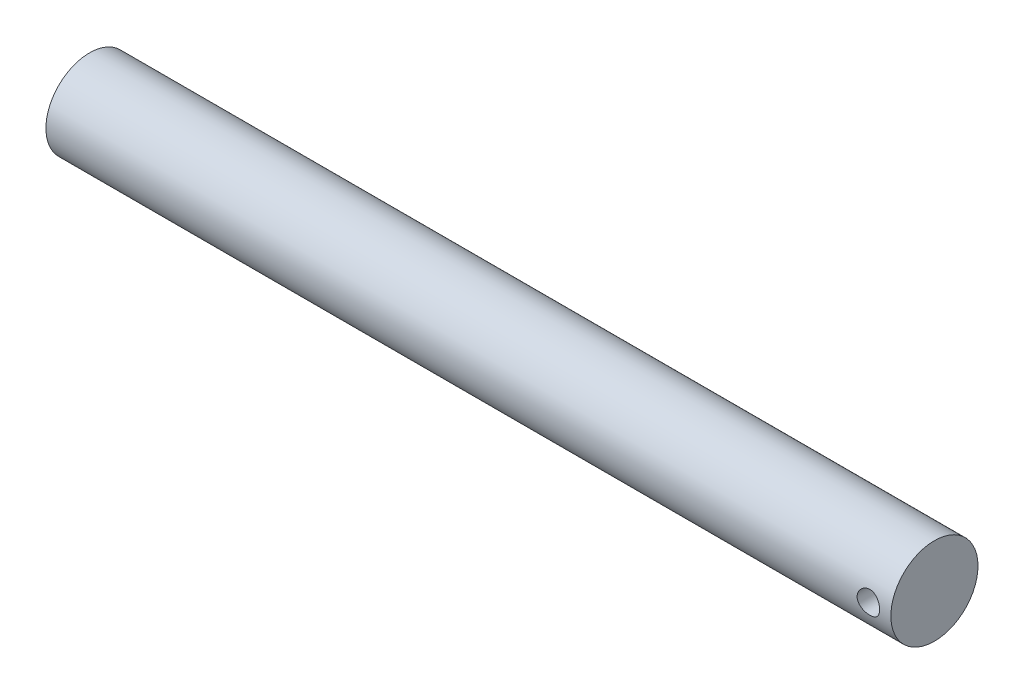
ISO-10303-21;
HEADER;
FILE_DESCRIPTION(('STEP AP214'),'2;1');
FILE_NAME('part.step','',(''),(''),'','','');
FILE_SCHEMA(('AUTOMOTIVE_DESIGN { 1 0 10303 214 1 1 1 1 }'));
ENDSEC;
DATA;
#1=APPLICATION_CONTEXT('core data for automotive mechanical design processes');
#2=APPLICATION_PROTOCOL_DEFINITION('international standard','automotive_design',2000,#1);
#3=PRODUCT_CONTEXT('',#1,'mechanical');
#4=PRODUCT('Part','Part','',(#3));
#5=PRODUCT_RELATED_PRODUCT_CATEGORY('part','',(#4));
#6=PRODUCT_DEFINITION_FORMATION('','',#4);
#7=PRODUCT_DEFINITION_CONTEXT('part definition',#1,'design');
#8=PRODUCT_DEFINITION('design','',#6,#7);
#9=PRODUCT_DEFINITION_SHAPE('','',#8);
#10=(LENGTH_UNIT() NAMED_UNIT(*) SI_UNIT(.MILLI.,.METRE.));
#11=(NAMED_UNIT(*) PLANE_ANGLE_UNIT() SI_UNIT($,.RADIAN.));
#12=(NAMED_UNIT(*) SI_UNIT($,.STERADIAN.) SOLID_ANGLE_UNIT());
#13=UNCERTAINTY_MEASURE_WITH_UNIT(LENGTH_MEASURE(1.E-05),#10,'distance_accuracy_value','');
#14=(GEOMETRIC_REPRESENTATION_CONTEXT(3) GLOBAL_UNCERTAINTY_ASSIGNED_CONTEXT((#13)) GLOBAL_UNIT_ASSIGNED_CONTEXT((#10,
#11,#12)) REPRESENTATION_CONTEXT('',''));
#15=CARTESIAN_POINT('',(0.,0.,0.));
#16=DIRECTION('',(0.,0.,1.));
#17=DIRECTION('',(1.,0.,0.));
#18=AXIS2_PLACEMENT_3D('',#15,#16,#17);
#19=CARTESIAN_POINT('',(127.214403743369,-1.4519796858127E-07,1.62563176598982E-07));
#20=DIRECTION('',(-1.,0.,0.));
#21=DIRECTION('',(0.,0.,1.));
#22=AXIS2_PLACEMENT_3D('',#19,#20,#21);
#23=CYLINDRICAL_SURFACE('',#22,7.275);
#24=CARTESIAN_POINT('',(125.339403743369,-1.4519796858127E-07,-7.27499983743682));
#25=CARTESIAN_POINT('',(125.339401035922,0.10348926710912,-7.27499816530983));
#26=CARTESIAN_POINT('',(125.330806916012,0.207008341885682,-7.27276969935665));
#27=CARTESIAN_POINT('',(125.296713254932,0.41107266522187,-7.26409605904251));
#28=CARTESIAN_POINT('',(125.271204793774,0.511616315412951,-7.25764865979818));
#29=CARTESIAN_POINT('',(125.204160601778,0.706754033756443,-7.24125004171158));
#30=CARTESIAN_POINT('',(125.162644768357,0.801355319260996,-7.23130317410223));
#31=CARTESIAN_POINT('',(125.06483604422,0.982251491087056,-7.20896123905966));
#32=CARTESIAN_POINT('',(125.008542430419,1.06854597067008,-7.19656605183633));
#33=CARTESIAN_POINT('',(124.881481134157,1.23225867447176,-7.17036786662899));
#34=CARTESIAN_POINT('',(124.810451784011,1.30947017108247,-7.15654206723138));
#35=CARTESIAN_POINT('',(124.656495109594,1.45102738342895,-7.12919005835779));
#36=CARTESIAN_POINT('',(124.573566360131,1.51537155583026,-7.11566388499239));
#37=CARTESIAN_POINT('',(124.39653926766,1.63035614136393,-7.09021121733508));
#38=CARTESIAN_POINT('',(124.302284243378,1.68076230565845,-7.07831358937699));
#39=CARTESIAN_POINT('',(124.106281704587,1.76493252948175,-7.05779888625709));
#40=CARTESIAN_POINT('',(124.004535474543,1.79869943442898,-7.04918125025335));
#41=CARTESIAN_POINT('',(123.798719442665,1.847921568059,-7.03643708937709));
#42=CARTESIAN_POINT('',(123.694744669504,1.86374993011354,-7.03221920112057));
#43=CARTESIAN_POINT('',(123.48553653968,1.87780840769314,-7.02847885719754));
#44=CARTESIAN_POINT('',(123.38030340471,1.87604157872928,-7.02895558628227));
#45=CARTESIAN_POINT('',(123.17444934159,1.85525685938531,-7.03446864603381));
#46=CARTESIAN_POINT('',(123.073779536908,1.8366867120066,-7.03938662790732));
#47=CARTESIAN_POINT('',(122.877034821839,1.78353805164649,-7.05303904744507));
#48=CARTESIAN_POINT('',(122.780960257651,1.74895833461543,-7.0617737721566));
#49=CARTESIAN_POINT('',(122.59494794822,1.66439823168143,-7.08218203124035));
#50=CARTESIAN_POINT('',(122.50508638438,1.61425788113159,-7.09388584874994));
#51=CARTESIAN_POINT('',(122.334893391913,1.50011155565221,-7.1188968471342));
#52=CARTESIAN_POINT('',(122.254563730957,1.43610301509652,-7.13220432448479));
#53=CARTESIAN_POINT('',(122.103152435688,1.29373166470888,-7.15941894729276));
#54=CARTESIAN_POINT('',(122.032425895394,1.21499184912191,-7.17333202861794));
#55=CARTESIAN_POINT('',(121.90511137327,1.04660076869289,-7.19982657248157));
#56=CARTESIAN_POINT('',(121.848523878416,0.956949128184511,-7.21240798914629));
#57=CARTESIAN_POINT('',(121.75095160377,0.768752915111847,-7.23489079305921));
#58=CARTESIAN_POINT('',(121.710027501854,0.670175551962985,-7.24478171576072));
#59=CARTESIAN_POINT('',(121.645432428361,0.467227886541009,-7.26069322763163));
#60=CARTESIAN_POINT('',(121.621757942753,0.362858768808884,-7.26671460506188));
#61=CARTESIAN_POINT('',(121.592883382388,0.154323698668705,-7.27409076066675));
#62=CARTESIAN_POINT('',(121.587200106017,0.0502288685895554,-7.2755675643182));
#63=CARTESIAN_POINT('',(121.59313983196,-0.157425410216796,-7.27403722424272));
#64=CARTESIAN_POINT('',(121.604761171645,-0.260984909419299,-7.27103051129197));
#65=CARTESIAN_POINT('',(121.644582805936,-0.462928972755168,-7.26094946275666));
#66=CARTESIAN_POINT('',(121.672516795464,-0.561369611000941,-7.25394050396363));
#67=CARTESIAN_POINT('',(121.743864295564,-0.752160585931922,-7.23664712267959));
#68=CARTESIAN_POINT('',(121.78727942402,-0.844510284876256,-7.22636235785629));
#69=CARTESIAN_POINT('',(121.889274855187,-1.0223999316947,-7.20336878932101));
#70=CARTESIAN_POINT('',(121.94812225212,-1.10778123723108,-7.19061845029347));
#71=CARTESIAN_POINT('',(122.078972949176,-1.26762761042253,-7.16416907365405));
#72=CARTESIAN_POINT('',(122.15097866979,-1.34209066510194,-7.15046986178421));
#73=CARTESIAN_POINT('',(122.308351063354,-1.47999871251215,-7.1232229932329));
#74=CARTESIAN_POINT('',(122.394018435478,-1.54310380892698,-7.10968871731736));
#75=CARTESIAN_POINT('',(122.575009177908,-1.65404565662363,-7.08470200319938));
#76=CARTESIAN_POINT('',(122.670332128003,-1.70188307198126,-7.07324947445958));
#77=CARTESIAN_POINT('',(122.867430133437,-1.78057233203929,-7.05385203726583));
#78=CARTESIAN_POINT('',(122.969163104375,-1.81152423867967,-7.04588652194131));
#79=CARTESIAN_POINT('',(123.176627563203,-1.85581632276681,-7.03435162330409));
#80=CARTESIAN_POINT('',(123.282358104295,-1.86916064390598,-7.03078120568152));
#81=CARTESIAN_POINT('',(123.491348177968,-1.87763213999518,-7.0285230821668));
#82=CARTESIAN_POINT('',(123.594584399858,-1.87330392371345,-7.02968939984793));
#83=CARTESIAN_POINT('',(123.79880153743,-1.84780733833074,-7.03643387665821));
#84=CARTESIAN_POINT('',(123.899782504025,-1.82663934978506,-7.04201193608814));
#85=CARTESIAN_POINT('',(124.095987945831,-1.76837004597069,-7.05686747120104));
#86=CARTESIAN_POINT('',(124.191246592032,-1.73137693374498,-7.06611979414189));
#87=CARTESIAN_POINT('',(124.37427530809,-1.64259222582295,-7.08728350236676));
#88=CARTESIAN_POINT('',(124.46204427338,-1.59079845222993,-7.09919527892921));
#89=CARTESIAN_POINT('',(124.630219301768,-1.47220128218724,-7.12474676696314));
#90=CARTESIAN_POINT('',(124.710355045662,-1.4050228315535,-7.13842511692889));
#91=CARTESIAN_POINT('',(124.85839315369,-1.25828612192734,-7.16574482259931));
#92=CARTESIAN_POINT('',(124.926292578865,-1.17872489732906,-7.1793861686434));
#93=CARTESIAN_POINT('',(125.049232119186,-1.00760070666639,-7.20541395913258));
#94=CARTESIAN_POINT('',(125.103994370752,-0.915833221342874,-7.21777059738638));
#95=CARTESIAN_POINT('',(125.197227557291,-0.724081961592573,-7.23951717701951));
#96=CARTESIAN_POINT('',(125.235709614217,-0.624103852260679,-7.2489091426231));
#97=CARTESIAN_POINT('',(125.28989232029,-0.436991481707566,-7.26235860220718));
#98=CARTESIAN_POINT('',(125.308417625527,-0.350711039425184,-7.26706560717339));
#99=CARTESIAN_POINT('',(125.33317396522,-0.176294181944226,-7.27338680491461));
#100=CARTESIAN_POINT('',(125.339406049717,-0.0881579259125014,-7.27500126184345));
#101=CARTESIAN_POINT('',(125.339403743369,-1.4519796858127E-07,-7.27499983743682));
#102=B_SPLINE_CURVE_WITH_KNOTS('',3,(#24,#25,#26,#27,#28,#29,#30,#31,#32,#33,#34,#35,#36,#37,
#38,#39,#40,#41,#42,#43,#44,#45,#46,#47,#48,#49,#50,#51,#52,#53,#54,#55,#56,#57,#58,#59,#60,#61,
#62,#63,#64,#65,#66,#67,#68,#69,#70,#71,#72,#73,#74,#75,#76,#77,#78,#79,#80,#81,#82,#83,#84,#85,
#86,#87,#88,#89,#90,#91,#92,#93,#94,#95,#96,#97,#98,#99,#100,#101),.UNSPECIFIED.,.T.,.F.,(4,2,2,
2,2,2,2,2,2,2,2,2,2,2,2,2,2,2,2,2,2,2,2,2,2,2,2,2,2,2,2,2,2,2,2,2,2,2,4),(0.,0.310145066201001,
0.620453821481812,0.930378095142215,1.24031753637464,1.55632172879941,1.87236380074124,
2.19343279199982,2.51444685936274,2.82865348807051,3.14280555385308,3.44882551367844,
3.75486849242974,4.06416810835245,4.37352499388314,4.69228012322287,5.01104622959507,
5.3310349872357,5.6509585396353,5.96221343182299,6.27343842057344,6.57971930789557,
6.88603221306638,7.19804348500638,7.51011220969187,7.83035940792571,8.15059267494039,
8.46890706601086,8.78714653299167,9.0956541054271,9.40415470622068,9.71057885079121,
10.0170481084865,10.3319820477552,10.6469915283538,10.9681698537718,11.2891284077726,
11.5533490256621,11.8175470738133),.UNSPECIFIED.);
#103=CARTESIAN_POINT('',(125.339403743369,-1.4519796858127E-07,-7.27499983743682));
#104=VERTEX_POINT('',#103);
#105=EDGE_CURVE('E39',#104,#104,#102,.T.);
#106=ORIENTED_EDGE('',*,*,#105,.T.);
#107=EDGE_LOOP('',(#106));
#108=FACE_BOUND('',#107,.T.);
#109=CARTESIAN_POINT('',(125.339403743369,-1.4519796858127E-07,7.27500016256317));
#110=CARTESIAN_POINT('',(125.339401035922,-0.103489557505057,7.27499849043618));
#111=CARTESIAN_POINT('',(125.330806916012,-0.20700863228162,7.272770024483));
#112=CARTESIAN_POINT('',(125.296713254932,-0.411072955617807,7.26409638416886));
#113=CARTESIAN_POINT('',(125.271204793774,-0.511616605808888,7.25764898492454));
#114=CARTESIAN_POINT('',(125.204160601778,-0.70675432415238,7.24125036683793));
#115=CARTESIAN_POINT('',(125.162644768357,-0.801355609656933,7.23130349922858));
#116=CARTESIAN_POINT('',(125.06483604422,-0.982251781482993,7.20896156418601));
#117=CARTESIAN_POINT('',(125.008542430419,-1.06854626106601,7.19656637696269));
#118=CARTESIAN_POINT('',(124.881481134157,-1.2322589648677,7.17036819175534));
#119=CARTESIAN_POINT('',(124.810451784011,-1.30947046147842,7.15654239235774));
#120=CARTESIAN_POINT('',(124.656495109594,-1.45102767382489,7.12919038348414));
#121=CARTESIAN_POINT('',(124.573566360131,-1.5153718462262,7.11566421011874));
#122=CARTESIAN_POINT('',(124.39653926766,-1.63035643175986,7.09021154246143));
#123=CARTESIAN_POINT('',(124.302284243378,-1.68076259605438,7.07831391450334));
#124=CARTESIAN_POINT('',(124.106281704587,-1.76493281987769,7.05779921138344));
#125=CARTESIAN_POINT('',(124.004535474543,-1.79869972482492,7.0491815753797));
#126=CARTESIAN_POINT('',(123.798719442665,-1.84792185845494,7.03643741450345));
#127=CARTESIAN_POINT('',(123.694744669504,-1.86375022050948,7.03221952624692));
#128=CARTESIAN_POINT('',(123.48553653968,-1.87780869808908,7.0284791823239));
#129=CARTESIAN_POINT('',(123.38030340471,-1.87604186912522,7.02895591140862));
#130=CARTESIAN_POINT('',(123.17444934159,-1.85525714978125,7.03446897116017));
#131=CARTESIAN_POINT('',(123.073779536908,-1.83668700240253,7.03938695303367));
#132=CARTESIAN_POINT('',(122.877034821839,-1.78353834204242,7.05303937257142));
#133=CARTESIAN_POINT('',(122.780960257651,-1.74895862501137,7.06177409728295));
#134=CARTESIAN_POINT('',(122.59494794822,-1.66439852207737,7.0821823563667));
#135=CARTESIAN_POINT('',(122.50508638438,-1.61425817152752,7.09388617387629));
#136=CARTESIAN_POINT('',(122.334893391913,-1.50011184604815,7.11889717226056));
#137=CARTESIAN_POINT('',(122.254563730957,-1.43610330549246,7.13220464961114));
#138=CARTESIAN_POINT('',(122.103152435688,-1.29373195510481,7.15941927241911));
#139=CARTESIAN_POINT('',(122.032425895394,-1.21499213951785,7.1733323537443));
#140=CARTESIAN_POINT('',(121.90511137327,-1.04660105908882,7.19982689760792));
#141=CARTESIAN_POINT('',(121.848523878416,-0.956949418580446,7.21240831427264));
#142=CARTESIAN_POINT('',(121.75095160377,-0.768753205507783,7.23489111818557));
#143=CARTESIAN_POINT('',(121.710027501854,-0.670175842358922,7.24478204088707));
#144=CARTESIAN_POINT('',(121.645432428361,-0.467228176936947,7.26069355275798));
#145=CARTESIAN_POINT('',(121.621757942753,-0.362859059204822,7.26671493018823));
#146=CARTESIAN_POINT('',(121.592883382388,-0.154323989064642,7.2740910857931));
#147=CARTESIAN_POINT('',(121.587200106017,-0.0502291589854925,7.27556788944455));
#148=CARTESIAN_POINT('',(121.59313983196,0.157425119820858,7.27403754936907));
#149=CARTESIAN_POINT('',(121.604761171645,0.260984619023362,7.27103083641833));
#150=CARTESIAN_POINT('',(121.644582805936,0.462928682359234,7.26094978788301));
#151=CARTESIAN_POINT('',(121.672516795464,0.56136932060501,7.25394082908998));
#152=CARTESIAN_POINT('',(121.743864295564,0.752160295535992,7.23664744780595));
#153=CARTESIAN_POINT('',(121.78727942402,0.844509994480322,7.22636268298264));
#154=CARTESIAN_POINT('',(121.889274855187,1.02239964129877,7.20336911444736));
#155=CARTESIAN_POINT('',(121.94812225212,1.10778094683514,7.19061877541982));
#156=CARTESIAN_POINT('',(122.078972949176,1.26762732002659,7.16416939878041));
#157=CARTESIAN_POINT('',(122.15097866979,1.342090374706,7.15047018691056));
#158=CARTESIAN_POINT('',(122.308351063354,1.47999842211621,7.12322331835926));
#159=CARTESIAN_POINT('',(122.394018435478,1.54310351853104,7.10968904244371));
#160=CARTESIAN_POINT('',(122.575009177908,1.65404536622769,7.08470232832573));
#161=CARTESIAN_POINT('',(122.670332128003,1.70188278158532,7.07324979958593));
#162=CARTESIAN_POINT('',(122.867430133437,1.78057204164336,7.05385236239218));
#163=CARTESIAN_POINT('',(122.969163104375,1.81152394828373,7.04588684706767));
#164=CARTESIAN_POINT('',(123.176627563203,1.85581603237087,7.03435194843044));
#165=CARTESIAN_POINT('',(123.282358104295,1.86916035351004,7.03078153080787));
#166=CARTESIAN_POINT('',(123.491348177968,1.87763184959924,7.02852340729315));
#167=CARTESIAN_POINT('',(123.594584399858,1.87330363331752,7.02968972497428));
#168=CARTESIAN_POINT('',(123.79880153743,1.8478070479348,7.03643420178456));
#169=CARTESIAN_POINT('',(123.899782504025,1.82663905938912,7.0420122612145));
#170=CARTESIAN_POINT('',(124.095987945831,1.76836975557476,7.05686779632739));
#171=CARTESIAN_POINT('',(124.191246592032,1.73137664334905,7.06612011926824));
#172=CARTESIAN_POINT('',(124.37427530809,1.64259193542701,7.08728382749311));
#173=CARTESIAN_POINT('',(124.46204427338,1.59079816183399,7.09919560405556));
#174=CARTESIAN_POINT('',(124.630219301768,1.4722009917913,7.12474709208949));
#175=CARTESIAN_POINT('',(124.710355045662,1.40502254115756,7.13842544205524));
#176=CARTESIAN_POINT('',(124.85839315369,1.25828583153141,7.16574514772566));
#177=CARTESIAN_POINT('',(124.926292578865,1.17872460693312,7.17938649376975));
#178=CARTESIAN_POINT('',(125.049232119186,1.00760041627046,7.20541428425893));
#179=CARTESIAN_POINT('',(125.103994370752,0.915832930946937,7.21777092251273));
#180=CARTESIAN_POINT('',(125.197227557291,0.724081671196636,7.23951750214586));
#181=CARTESIAN_POINT('',(125.235709614217,0.624103561864742,7.24890946774946));
#182=CARTESIAN_POINT('',(125.28989232029,0.436991191311629,7.26235892733353));
#183=CARTESIAN_POINT('',(125.308417625527,0.350710749029247,7.26706593229974));
#184=CARTESIAN_POINT('',(125.33317396522,0.176293891548289,7.27338713004096));
#185=CARTESIAN_POINT('',(125.339406049717,0.0881576355165642,7.2750015869698));
#186=CARTESIAN_POINT('',(125.339403743369,-1.4519796858127E-07,7.27500016256317));
#187=B_SPLINE_CURVE_WITH_KNOTS('',3,(#109,#110,#111,#112,#113,#114,#115,#116,#117,#118,#119,
#120,#121,#122,#123,#124,#125,#126,#127,#128,#129,#130,#131,#132,#133,#134,#135,#136,#137,#138,
#139,#140,#141,#142,#143,#144,#145,#146,#147,#148,#149,#150,#151,#152,#153,#154,#155,#156,#157,
#158,#159,#160,#161,#162,#163,#164,#165,#166,#167,#168,#169,#170,#171,#172,#173,#174,#175,#176,
#177,#178,#179,#180,#181,#182,#183,#184,#185,#186),.UNSPECIFIED.,.T.,.F.,(4,2,2,2,2,2,2,2,2,2,2,
2,2,2,2,2,2,2,2,2,2,2,2,2,2,2,2,2,2,2,2,2,2,2,2,2,2,2,4),(0.,0.310145066201001,
0.620453821481812,0.930378095142215,1.24031753637464,1.55632172879942,1.87236380074124,
2.19343279199982,2.51444685936274,2.82865348807052,3.14280555385308,3.44882551367844,
3.75486849242974,4.06416810835245,4.37352499388315,4.69228012322289,5.01104622959507,
5.3310349872357,5.6509585396353,5.962213431823,6.27343842057345,6.57971930789558,
6.88603221306639,7.19804348500638,7.51011220969188,7.83035940792572,8.15059267494039,
8.46890706601087,8.78714653299167,9.09565410542711,9.40415470622068,9.71057885079121,
10.0170481084865,10.3319820477552,10.6469915283538,10.9681698537718,11.2891284077726,
11.5533490256621,11.8175470738133),.UNSPECIFIED.);
#188=CARTESIAN_POINT('',(125.339403743369,-1.4519796858127E-07,7.27500016256317));
#189=VERTEX_POINT('',#188);
#190=EDGE_CURVE('E43',#189,#189,#187,.T.);
#191=ORIENTED_EDGE('',*,*,#190,.T.);
#192=EDGE_LOOP('',(#191));
#193=FACE_BOUND('',#192,.T.);
#194=CARTESIAN_POINT('',(127.214403743369,-1.4519796858127E-07,1.62563176598982E-07));
#195=DIRECTION('',(1.,0.,0.));
#196=DIRECTION('',(0.,0.,-1.));
#197=AXIS2_PLACEMENT_3D('',#194,#195,#196);
#198=CIRCLE('',#197,7.275);
#199=CARTESIAN_POINT('',(127.214403743369,-1.4519796858127E-07,-7.27499983743682));
#200=VERTEX_POINT('',#199);
#201=EDGE_CURVE('E47',#200,#200,#198,.T.);
#202=ORIENTED_EDGE('',*,*,#201,.F.);
#203=EDGE_LOOP('',(#202));
#204=FACE_BOUND('',#203,.T.);
#205=CARTESIAN_POINT('',(-13.8368490834071,-1.4519796858127E-07,1.62563176598982E-07));
#206=DIRECTION('',(1.,0.,0.));
#207=DIRECTION('',(0.,0.,-1.));
#208=AXIS2_PLACEMENT_3D('',#205,#206,#207);
#209=CIRCLE('',#208,7.275);
#210=CARTESIAN_POINT('',(-13.8368490834071,-1.4519796858127E-07,-7.27499983743682));
#211=VERTEX_POINT('',#210);
#212=EDGE_CURVE('E10',#211,#211,#209,.T.);
#213=ORIENTED_EDGE('',*,*,#212,.T.);
#214=EDGE_LOOP('',(#213));
#215=FACE_BOUND('',#214,.T.);
#216=ADVANCED_FACE('F32',(#108,#193,#204,#215),#23,.T.);
#217=CARTESIAN_POINT('',(127.214403743369,-1.4519796858127E-07,1.62563176598982E-07));
#218=DIRECTION('',(1.,0.,0.));
#219=DIRECTION('',(0.,0.,-1.));
#220=AXIS2_PLACEMENT_3D('',#217,#218,#219);
#221=PLANE('',#220);
#222=ORIENTED_EDGE('',*,*,#201,.T.);
#223=EDGE_LOOP('',(#222));
#224=FACE_BOUND('',#223,.T.);
#225=ADVANCED_FACE('F62',(#224),#221,.T.);
#226=CARTESIAN_POINT('',(123.464403743369,-1.4519796858127E-07,-7.27499983743682));
#227=DIRECTION('',(0.,0.,1.));
#228=DIRECTION('',(1.,0.,0.));
#229=AXIS2_PLACEMENT_3D('',#226,#227,#228);
#230=CYLINDRICAL_SURFACE('',#229,1.875);
#231=ORIENTED_EDGE('',*,*,#190,.F.);
#232=EDGE_LOOP('',(#231));
#233=FACE_BOUND('',#232,.T.);
#234=ORIENTED_EDGE('',*,*,#105,.F.);
#235=EDGE_LOOP('',(#234));
#236=FACE_BOUND('',#235,.T.);
#237=ADVANCED_FACE('F57',(#233,#236),#230,.F.);
#238=CARTESIAN_POINT('',(-13.8368490834071,-7.27500014519797,-78.3760316237547));
#239=DIRECTION('',(1.,0.,0.));
#240=DIRECTION('',(0.,0.,-1.));
#241=AXIS2_PLACEMENT_3D('',#238,#239,#240);
#242=PLANE('',#241);
#243=ORIENTED_EDGE('',*,*,#212,.F.);
#244=EDGE_LOOP('',(#243));
#245=FACE_BOUND('',#244,.T.);
#246=ADVANCED_FACE('F61',(#245),#242,.F.);
#247=CLOSED_SHELL('',(#216,#225,#237,#246));
#248=MANIFOLD_SOLID_BREP('B2',#247);
#249=ADVANCED_BREP_SHAPE_REPRESENTATION('',(#18,#248),#14);
#250=SHAPE_DEFINITION_REPRESENTATION(#9,#249);
ENDSEC;
END-ISO-10303-21;
